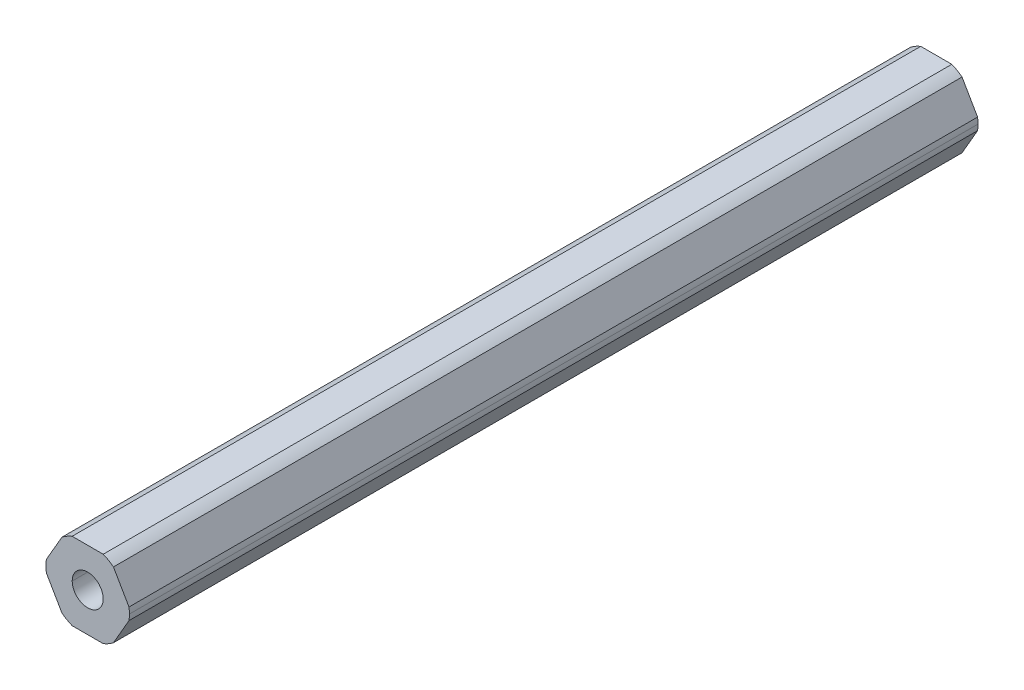
ISO-10303-21;
HEADER;
FILE_DESCRIPTION(('STEP AP214'),'2;1');
FILE_NAME('part.step','',(''),(''),'','','');
FILE_SCHEMA(('AUTOMOTIVE_DESIGN { 1 0 10303 214 1 1 1 1 }'));
ENDSEC;
DATA;
#1=APPLICATION_CONTEXT('core data for automotive mechanical design processes');
#2=APPLICATION_PROTOCOL_DEFINITION('international standard','automotive_design',2000,#1);
#3=PRODUCT_CONTEXT('',#1,'mechanical');
#4=PRODUCT('Part','Part','',(#3));
#5=PRODUCT_RELATED_PRODUCT_CATEGORY('part','',(#4));
#6=PRODUCT_DEFINITION_FORMATION('','',#4);
#7=PRODUCT_DEFINITION_CONTEXT('part definition',#1,'design');
#8=PRODUCT_DEFINITION('design','',#6,#7);
#9=PRODUCT_DEFINITION_SHAPE('','',#8);
#10=(LENGTH_UNIT() NAMED_UNIT(*) SI_UNIT(.MILLI.,.METRE.));
#11=(NAMED_UNIT(*) PLANE_ANGLE_UNIT() SI_UNIT($,.RADIAN.));
#12=(NAMED_UNIT(*) SI_UNIT($,.STERADIAN.) SOLID_ANGLE_UNIT());
#13=UNCERTAINTY_MEASURE_WITH_UNIT(LENGTH_MEASURE(1.E-05),#10,'distance_accuracy_value','');
#14=(GEOMETRIC_REPRESENTATION_CONTEXT(3) GLOBAL_UNCERTAINTY_ASSIGNED_CONTEXT((#13)) GLOBAL_UNIT_ASSIGNED_CONTEXT((#10,
#11,#12)) REPRESENTATION_CONTEXT('',''));
#15=CARTESIAN_POINT('',(0.,0.,0.));
#16=DIRECTION('',(0.,0.,1.));
#17=DIRECTION('',(1.,0.,0.));
#18=AXIS2_PLACEMENT_3D('',#15,#16,#17);
#19=CARTESIAN_POINT('',(0.,0.,-457.2));
#20=DIRECTION('',(0.,0.,1.));
#21=DIRECTION('',(1.,0.,0.));
#22=AXIS2_PLACEMENT_3D('',#19,#20,#21);
#23=CYLINDRICAL_SURFACE('',#22,2.55);
#24=DIRECTION('',(0.,0.,1.));
#25=VECTOR('',#24,1.);
#26=CARTESIAN_POINT('',(2.55,0.,-457.2));
#27=LINE('',#26,#25);
#28=CARTESIAN_POINT('',(2.55,0.,-457.2));
#29=VERTEX_POINT('',#28);
#30=CARTESIAN_POINT('',(2.55,0.,-317.5));
#31=VERTEX_POINT('',#30);
#32=EDGE_CURVE('E267',#29,#31,#27,.T.);
#33=ORIENTED_EDGE('',*,*,#32,.T.);
#34=CARTESIAN_POINT('',(0.,0.,-317.5));
#35=DIRECTION('',(0.,0.,-1.));
#36=DIRECTION('',(-1.,0.,0.));
#37=AXIS2_PLACEMENT_3D('',#34,#35,#36);
#38=CIRCLE('',#37,2.55);
#39=CARTESIAN_POINT('',(-2.55,0.,-317.5));
#40=VERTEX_POINT('',#39);
#41=EDGE_CURVE('E72',#31,#40,#38,.F.);
#42=ORIENTED_EDGE('',*,*,#41,.T.);
#43=DIRECTION('',(0.,0.,1.));
#44=VECTOR('',#43,1.);
#45=CARTESIAN_POINT('',(-2.55,0.,-457.2));
#46=LINE('',#45,#44);
#47=CARTESIAN_POINT('',(-2.55,0.,-457.2));
#48=VERTEX_POINT('',#47);
#49=EDGE_CURVE('E263',#48,#40,#46,.T.);
#50=ORIENTED_EDGE('',*,*,#49,.F.);
#51=CARTESIAN_POINT('',(0.,0.,-457.2));
#52=DIRECTION('',(0.,0.,1.));
#53=DIRECTION('',(1.,0.,0.));
#54=AXIS2_PLACEMENT_3D('',#51,#52,#53);
#55=CIRCLE('',#54,2.55);
#56=EDGE_CURVE('E58',#29,#48,#55,.T.);
#57=ORIENTED_EDGE('',*,*,#56,.F.);
#58=EDGE_LOOP('',(#33,#42,#50,#57));
#59=FACE_BOUND('',#58,.T.);
#60=ADVANCED_FACE('F49',(#59),#23,.F.);
#61=CARTESIAN_POINT('',(0.,0.,-457.2));
#62=DIRECTION('',(0.,0.,1.));
#63=DIRECTION('',(1.,0.,0.));
#64=AXIS2_PLACEMENT_3D('',#61,#62,#63);
#65=CYLINDRICAL_SURFACE('',#64,6.87);
#66=CARTESIAN_POINT('',(0.,0.,-317.5));
#67=DIRECTION('',(0.,0.,-1.));
#68=DIRECTION('',(-1.,0.,0.));
#69=AXIS2_PLACEMENT_3D('',#66,#67,#68);
#70=CIRCLE('',#69,6.87);
#71=CARTESIAN_POINT('',(4.24149521323254,5.40431479062105,-317.5));
#72=VERTEX_POINT('',#71);
#73=CARTESIAN_POINT('',(2.55952629210953,6.3754,-317.5));
#74=VERTEX_POINT('',#73);
#75=EDGE_CURVE('E169',#72,#74,#70,.F.);
#76=ORIENTED_EDGE('',*,*,#75,.F.);
#77=DIRECTION('',(0.,0.,-1.));
#78=VECTOR('',#77,1.);
#79=CARTESIAN_POINT('',(4.24149521323254,5.40431479062105,-457.2));
#80=LINE('',#79,#78);
#81=CARTESIAN_POINT('',(4.24149521323254,5.40431479062105,-457.2));
#82=VERTEX_POINT('',#81);
#83=EDGE_CURVE('E198',#72,#82,#80,.T.);
#84=ORIENTED_EDGE('',*,*,#83,.T.);
#85=CARTESIAN_POINT('',(0.,0.,-457.2));
#86=DIRECTION('',(0.,0.,1.));
#87=DIRECTION('',(1.,0.,0.));
#88=AXIS2_PLACEMENT_3D('',#85,#86,#87);
#89=CIRCLE('',#88,6.87);
#90=CARTESIAN_POINT('',(2.55952629210952,6.3754,-457.2));
#91=VERTEX_POINT('',#90);
#92=EDGE_CURVE('E194',#82,#91,#89,.T.);
#93=ORIENTED_EDGE('',*,*,#92,.T.);
#94=DIRECTION('',(0.,0.,1.));
#95=VECTOR('',#94,1.);
#96=CARTESIAN_POINT('',(2.55952629210952,6.3754,-457.2));
#97=LINE('',#96,#95);
#98=EDGE_CURVE('E187',#91,#74,#97,.T.);
#99=ORIENTED_EDGE('',*,*,#98,.T.);
#100=EDGE_LOOP('',(#76,#84,#93,#99));
#101=FACE_BOUND('',#100,.T.);
#102=ADVANCED_FACE('F192',(#101),#65,.T.);
#103=CARTESIAN_POINT('',(0.,0.,-457.2));
#104=DIRECTION('',(0.,0.,1.));
#105=DIRECTION('',(1.,0.,0.));
#106=AXIS2_PLACEMENT_3D('',#103,#104,#105);
#107=CYLINDRICAL_SURFACE('',#106,6.87);
#108=CARTESIAN_POINT('',(0.,0.,-317.5));
#109=DIRECTION('',(0.,0.,-1.));
#110=DIRECTION('',(-1.,0.,0.));
#111=AXIS2_PLACEMENT_3D('',#108,#109,#110);
#112=CIRCLE('',#111,6.87);
#113=CARTESIAN_POINT('',(-2.55952629210953,6.3754,-317.5));
#114=VERTEX_POINT('',#113);
#115=CARTESIAN_POINT('',(-4.24149521323254,5.40431479062105,-317.5));
#116=VERTEX_POINT('',#115);
#117=EDGE_CURVE('E328',#114,#116,#112,.F.);
#118=ORIENTED_EDGE('',*,*,#117,.F.);
#119=DIRECTION('',(0.,0.,-1.));
#120=VECTOR('',#119,1.);
#121=CARTESIAN_POINT('',(-2.55952629210953,6.3754,-457.2));
#122=LINE('',#121,#120);
#123=CARTESIAN_POINT('',(-2.55952629210953,6.3754,-457.2));
#124=VERTEX_POINT('',#123);
#125=EDGE_CURVE('E188',#114,#124,#122,.T.);
#126=ORIENTED_EDGE('',*,*,#125,.T.);
#127=CARTESIAN_POINT('',(0.,0.,-457.2));
#128=DIRECTION('',(0.,0.,1.));
#129=DIRECTION('',(1.,0.,0.));
#130=AXIS2_PLACEMENT_3D('',#127,#128,#129);
#131=CIRCLE('',#130,6.87);
#132=CARTESIAN_POINT('',(-4.24149521323255,5.40431479062105,-457.2));
#133=VERTEX_POINT('',#132);
#134=EDGE_CURVE('E302',#124,#133,#131,.T.);
#135=ORIENTED_EDGE('',*,*,#134,.T.);
#136=DIRECTION('',(0.,0.,1.));
#137=VECTOR('',#136,1.);
#138=CARTESIAN_POINT('',(-4.24149521323255,5.40431479062105,-457.2));
#139=LINE('',#138,#137);
#140=EDGE_CURVE('E211',#133,#116,#139,.T.);
#141=ORIENTED_EDGE('',*,*,#140,.T.);
#142=EDGE_LOOP('',(#118,#126,#135,#141));
#143=FACE_BOUND('',#142,.T.);
#144=ADVANCED_FACE('F526',(#143),#107,.T.);
#145=CARTESIAN_POINT('',(0.,0.,-457.2));
#146=DIRECTION('',(0.,0.,1.));
#147=DIRECTION('',(1.,0.,0.));
#148=AXIS2_PLACEMENT_3D('',#145,#146,#147);
#149=CYLINDRICAL_SURFACE('',#148,6.87);
#150=CARTESIAN_POINT('',(0.,0.,-317.5));
#151=DIRECTION('',(0.,0.,-1.));
#152=DIRECTION('',(-1.,0.,0.));
#153=AXIS2_PLACEMENT_3D('',#150,#151,#152);
#154=CIRCLE('',#153,6.87);
#155=CARTESIAN_POINT('',(-6.80102150534207,0.97108520937896,-317.5));
#156=VERTEX_POINT('',#155);
#157=CARTESIAN_POINT('',(-6.80102150534208,-0.971085209378956,-317.5));
#158=VERTEX_POINT('',#157);
#159=EDGE_CURVE('E332',#156,#158,#154,.F.);
#160=ORIENTED_EDGE('',*,*,#159,.F.);
#161=DIRECTION('',(0.,0.,-1.));
#162=VECTOR('',#161,1.);
#163=CARTESIAN_POINT('',(-6.80102150534208,0.97108520937896,-457.2));
#164=LINE('',#163,#162);
#165=CARTESIAN_POINT('',(-6.80102150534208,0.97108520937896,-457.2));
#166=VERTEX_POINT('',#165);
#167=EDGE_CURVE('E217',#156,#166,#164,.T.);
#168=ORIENTED_EDGE('',*,*,#167,.T.);
#169=CARTESIAN_POINT('',(0.,0.,-457.2));
#170=DIRECTION('',(0.,0.,1.));
#171=DIRECTION('',(1.,0.,0.));
#172=AXIS2_PLACEMENT_3D('',#169,#170,#171);
#173=CIRCLE('',#172,6.87);
#174=CARTESIAN_POINT('',(-6.80102150534208,-0.971085209378956,-457.2));
#175=VERTEX_POINT('',#174);
#176=EDGE_CURVE('E259',#166,#175,#173,.T.);
#177=ORIENTED_EDGE('',*,*,#176,.T.);
#178=DIRECTION('',(0.,0.,1.));
#179=VECTOR('',#178,1.);
#180=CARTESIAN_POINT('',(-6.80102150534208,-0.971085209378962,-457.2));
#181=LINE('',#180,#179);
#182=EDGE_CURVE('E212',#175,#158,#181,.T.);
#183=ORIENTED_EDGE('',*,*,#182,.T.);
#184=EDGE_LOOP('',(#160,#168,#177,#183));
#185=FACE_BOUND('',#184,.T.);
#186=ADVANCED_FACE('F316',(#185),#149,.T.);
#187=CARTESIAN_POINT('',(0.,0.,-457.2));
#188=DIRECTION('',(0.,0.,1.));
#189=DIRECTION('',(1.,0.,0.));
#190=AXIS2_PLACEMENT_3D('',#187,#188,#189);
#191=CYLINDRICAL_SURFACE('',#190,6.87);
#192=CARTESIAN_POINT('',(0.,0.,-317.5));
#193=DIRECTION('',(0.,0.,-1.));
#194=DIRECTION('',(-1.,0.,0.));
#195=AXIS2_PLACEMENT_3D('',#192,#193,#194);
#196=CIRCLE('',#195,6.87);
#197=CARTESIAN_POINT('',(-4.24149521323254,-5.40431479062105,-317.5));
#198=VERTEX_POINT('',#197);
#199=CARTESIAN_POINT('',(-2.55952629210953,-6.3754,-317.5));
#200=VERTEX_POINT('',#199);
#201=EDGE_CURVE('E264',#198,#200,#196,.F.);
#202=ORIENTED_EDGE('',*,*,#201,.F.);
#203=DIRECTION('',(0.,0.,-1.));
#204=VECTOR('',#203,1.);
#205=CARTESIAN_POINT('',(-4.24149521323255,-5.40431479062104,-457.2));
#206=LINE('',#205,#204);
#207=CARTESIAN_POINT('',(-4.24149521323254,-5.40431479062105,-457.2));
#208=VERTEX_POINT('',#207);
#209=EDGE_CURVE('E255',#198,#208,#206,.T.);
#210=ORIENTED_EDGE('',*,*,#209,.T.);
#211=CARTESIAN_POINT('',(0.,0.,-457.2));
#212=DIRECTION('',(0.,0.,1.));
#213=DIRECTION('',(1.,0.,0.));
#214=AXIS2_PLACEMENT_3D('',#211,#212,#213);
#215=CIRCLE('',#214,6.87);
#216=CARTESIAN_POINT('',(-2.55952629210953,-6.3754,-457.2));
#217=VERTEX_POINT('',#216);
#218=EDGE_CURVE('E256',#208,#217,#215,.T.);
#219=ORIENTED_EDGE('',*,*,#218,.T.);
#220=DIRECTION('',(0.,0.,1.));
#221=VECTOR('',#220,1.);
#222=CARTESIAN_POINT('',(-2.55952629210953,-6.3754,-457.2));
#223=LINE('',#222,#221);
#224=EDGE_CURVE('E245',#217,#200,#223,.T.);
#225=ORIENTED_EDGE('',*,*,#224,.T.);
#226=EDGE_LOOP('',(#202,#210,#219,#225));
#227=FACE_BOUND('',#226,.T.);
#228=ADVANCED_FACE('F363',(#227),#191,.T.);
#229=CARTESIAN_POINT('',(0.,0.,-457.2));
#230=DIRECTION('',(0.,0.,1.));
#231=DIRECTION('',(1.,0.,0.));
#232=AXIS2_PLACEMENT_3D('',#229,#230,#231);
#233=CYLINDRICAL_SURFACE('',#232,6.87);
#234=CARTESIAN_POINT('',(0.,0.,-317.5));
#235=DIRECTION('',(0.,0.,-1.));
#236=DIRECTION('',(-1.,0.,0.));
#237=AXIS2_PLACEMENT_3D('',#234,#235,#236);
#238=CIRCLE('',#237,6.87);
#239=CARTESIAN_POINT('',(2.55952629210953,-6.3754,-317.5));
#240=VERTEX_POINT('',#239);
#241=CARTESIAN_POINT('',(4.24149521323254,-5.40431479062105,-317.5));
#242=VERTEX_POINT('',#241);
#243=EDGE_CURVE('E342',#240,#242,#238,.F.);
#244=ORIENTED_EDGE('',*,*,#243,.F.);
#245=DIRECTION('',(0.,0.,-1.));
#246=VECTOR('',#245,1.);
#247=CARTESIAN_POINT('',(2.55952629210953,-6.3754,-457.2));
#248=LINE('',#247,#246);
#249=CARTESIAN_POINT('',(2.55952629210953,-6.3754,-457.2));
#250=VERTEX_POINT('',#249);
#251=EDGE_CURVE('E244',#240,#250,#248,.T.);
#252=ORIENTED_EDGE('',*,*,#251,.T.);
#253=CARTESIAN_POINT('',(0.,0.,-457.2));
#254=DIRECTION('',(0.,0.,1.));
#255=DIRECTION('',(1.,0.,0.));
#256=AXIS2_PLACEMENT_3D('',#253,#254,#255);
#257=CIRCLE('',#256,6.87);
#258=CARTESIAN_POINT('',(4.24149521323254,-5.40431479062105,-457.2));
#259=VERTEX_POINT('',#258);
#260=EDGE_CURVE('E220',#250,#259,#257,.T.);
#261=ORIENTED_EDGE('',*,*,#260,.T.);
#262=DIRECTION('',(0.,0.,1.));
#263=VECTOR('',#262,1.);
#264=CARTESIAN_POINT('',(4.24149521323255,-5.40431479062104,-457.2));
#265=LINE('',#264,#263);
#266=EDGE_CURVE('E296',#259,#242,#265,.T.);
#267=ORIENTED_EDGE('',*,*,#266,.T.);
#268=EDGE_LOOP('',(#244,#252,#261,#267));
#269=FACE_BOUND('',#268,.T.);
#270=ADVANCED_FACE('F369',(#269),#233,.T.);
#271=CARTESIAN_POINT('',(0.,0.,-457.2));
#272=DIRECTION('',(0.,0.,1.));
#273=DIRECTION('',(1.,0.,0.));
#274=AXIS2_PLACEMENT_3D('',#271,#272,#273);
#275=CYLINDRICAL_SURFACE('',#274,6.87);
#276=CARTESIAN_POINT('',(0.,0.,-317.5));
#277=DIRECTION('',(0.,0.,-1.));
#278=DIRECTION('',(-1.,0.,0.));
#279=AXIS2_PLACEMENT_3D('',#276,#277,#278);
#280=CIRCLE('',#279,6.87);
#281=CARTESIAN_POINT('',(6.87,0.,-317.5));
#282=VERTEX_POINT('',#281);
#283=CARTESIAN_POINT('',(6.80102150534208,0.97108520937895,-317.5));
#284=VERTEX_POINT('',#283);
#285=EDGE_CURVE('E345',#282,#284,#280,.F.);
#286=ORIENTED_EDGE('',*,*,#285,.F.);
#287=DIRECTION('',(0.,0.,1.));
#288=VECTOR('',#287,1.);
#289=CARTESIAN_POINT('',(6.87,0.,-457.2));
#290=LINE('',#289,#288);
#291=CARTESIAN_POINT('',(6.87,0.,-457.2));
#292=VERTEX_POINT('',#291);
#293=EDGE_CURVE('E277',#292,#282,#290,.T.);
#294=ORIENTED_EDGE('',*,*,#293,.F.);
#295=CARTESIAN_POINT('',(0.,0.,-457.2));
#296=DIRECTION('',(0.,0.,1.));
#297=DIRECTION('',(1.,0.,0.));
#298=AXIS2_PLACEMENT_3D('',#295,#296,#297);
#299=CIRCLE('',#298,6.87);
#300=CARTESIAN_POINT('',(6.80102150534208,0.97108520937895,-457.2));
#301=VERTEX_POINT('',#300);
#302=EDGE_CURVE('E218',#292,#301,#299,.T.);
#303=ORIENTED_EDGE('',*,*,#302,.T.);
#304=DIRECTION('',(0.,0.,1.));
#305=VECTOR('',#304,1.);
#306=CARTESIAN_POINT('',(6.80102150534208,0.971085209378949,-457.2));
#307=LINE('',#306,#305);
#308=EDGE_CURVE('E251',#301,#284,#307,.T.);
#309=ORIENTED_EDGE('',*,*,#308,.T.);
#310=EDGE_LOOP('',(#286,#294,#303,#309));
#311=FACE_BOUND('',#310,.T.);
#312=ADVANCED_FACE('F502',(#311),#275,.T.);
#313=CARTESIAN_POINT('',(0.,0.,-457.2));
#314=DIRECTION('',(0.,0.,1.));
#315=DIRECTION('',(1.,0.,0.));
#316=AXIS2_PLACEMENT_3D('',#313,#314,#315);
#317=PLANE('',#316);
#318=ORIENTED_EDGE('',*,*,#56,.T.);
#319=CARTESIAN_POINT('',(0.,0.,-457.2));
#320=DIRECTION('',(0.,0.,1.));
#321=DIRECTION('',(1.,0.,0.));
#322=AXIS2_PLACEMENT_3D('',#319,#320,#321);
#323=CIRCLE('',#322,2.55);
#324=EDGE_CURVE('E260',#48,#29,#323,.T.);
#325=ORIENTED_EDGE('',*,*,#324,.T.);
#326=EDGE_LOOP('',(#318,#325));
#327=FACE_BOUND('',#326,.T.);
#328=ORIENTED_EDGE('',*,*,#92,.F.);
#329=DIRECTION('',(-0.5,0.866025403784439,0.));
#330=VECTOR('',#329,1.);
#331=CARTESIAN_POINT('',(7.36167781238308,0.,-457.2));
#332=LINE('',#331,#330);
#333=EDGE_CURVE('E204',#301,#82,#332,.T.);
#334=ORIENTED_EDGE('',*,*,#333,.F.);
#335=ORIENTED_EDGE('',*,*,#302,.F.);
#336=CARTESIAN_POINT('',(0.,0.,-457.2));
#337=DIRECTION('',(0.,0.,1.));
#338=DIRECTION('',(1.,0.,0.));
#339=AXIS2_PLACEMENT_3D('',#336,#337,#338);
#340=CIRCLE('',#339,6.87);
#341=CARTESIAN_POINT('',(6.80102150534208,-0.971085209378955,-457.2));
#342=VERTEX_POINT('',#341);
#343=EDGE_CURVE('E270',#342,#292,#340,.T.);
#344=ORIENTED_EDGE('',*,*,#343,.F.);
#345=DIRECTION('',(0.5,0.866025403784439,0.));
#346=VECTOR('',#345,1.);
#347=CARTESIAN_POINT('',(3.68083890619154,-6.3754,-457.2));
#348=LINE('',#347,#346);
#349=EDGE_CURVE('E290',#259,#342,#348,.T.);
#350=ORIENTED_EDGE('',*,*,#349,.F.);
#351=ORIENTED_EDGE('',*,*,#260,.F.);
#352=DIRECTION('',(1.,0.,0.));
#353=VECTOR('',#352,1.);
#354=CARTESIAN_POINT('',(-3.68083890619154,-6.3754,-457.2));
#355=LINE('',#354,#353);
#356=EDGE_CURVE('E240',#217,#250,#355,.T.);
#357=ORIENTED_EDGE('',*,*,#356,.F.);
#358=ORIENTED_EDGE('',*,*,#218,.F.);
#359=DIRECTION('',(0.5,-0.866025403784439,0.));
#360=VECTOR('',#359,1.);
#361=CARTESIAN_POINT('',(-7.36167781238308,0.,-457.2));
#362=LINE('',#361,#360);
#363=EDGE_CURVE('E216',#175,#208,#362,.T.);
#364=ORIENTED_EDGE('',*,*,#363,.F.);
#365=ORIENTED_EDGE('',*,*,#176,.F.);
#366=DIRECTION('',(-0.5,-0.866025403784439,0.));
#367=VECTOR('',#366,1.);
#368=CARTESIAN_POINT('',(-3.68083890619154,6.3754,-457.2));
#369=LINE('',#368,#367);
#370=EDGE_CURVE('E223',#133,#166,#369,.T.);
#371=ORIENTED_EDGE('',*,*,#370,.F.);
#372=ORIENTED_EDGE('',*,*,#134,.F.);
#373=DIRECTION('',(-1.,0.,0.));
#374=VECTOR('',#373,1.);
#375=CARTESIAN_POINT('',(3.68083890619154,6.3754,-457.2));
#376=LINE('',#375,#374);
#377=EDGE_CURVE('E197',#91,#124,#376,.T.);
#378=ORIENTED_EDGE('',*,*,#377,.F.);
#379=EDGE_LOOP('',(#328,#334,#335,#344,#350,#351,#357,#358,#364,#365,#371,#372,#378));
#380=FACE_BOUND('',#379,.T.);
#381=ADVANCED_FACE('F320',(#327,#380),#317,.F.);
#382=CARTESIAN_POINT('',(-3.68083890619154,-6.3754,457.2));
#383=DIRECTION('',(0.,1.,0.));
#384=DIRECTION('',(1.,0.,0.));
#385=AXIS2_PLACEMENT_3D('',#382,#383,#384);
#386=PLANE('',#385);
#387=ORIENTED_EDGE('',*,*,#251,.F.);
#388=DIRECTION('',(-1.,0.,0.));
#389=VECTOR('',#388,1.);
#390=CARTESIAN_POINT('',(-23.065396683762,-6.3754,-317.5));
#391=LINE('',#390,#389);
#392=EDGE_CURVE('E190',#240,#200,#391,.T.);
#393=ORIENTED_EDGE('',*,*,#392,.T.);
#394=ORIENTED_EDGE('',*,*,#224,.F.);
#395=ORIENTED_EDGE('',*,*,#356,.T.);
#396=EDGE_LOOP('',(#387,#393,#394,#395));
#397=FACE_BOUND('',#396,.T.);
#398=ADVANCED_FACE('F360',(#397),#386,.F.);
#399=CARTESIAN_POINT('',(-7.36167781238308,0.,457.2));
#400=DIRECTION('',(0.866025403784439,0.5,0.));
#401=DIRECTION('',(0.,0.,-1.));
#402=AXIS2_PLACEMENT_3D('',#399,#400,#401);
#403=PLANE('',#402);
#404=ORIENTED_EDGE('',*,*,#209,.F.);
#405=DIRECTION('',(-0.5,0.866025403784439,0.));
#406=VECTOR('',#405,1.);
#407=CARTESIAN_POINT('',(-7.36167781238308,0.,-317.5));
#408=LINE('',#407,#406);
#409=EDGE_CURVE('E325',#198,#158,#408,.T.);
#410=ORIENTED_EDGE('',*,*,#409,.T.);
#411=ORIENTED_EDGE('',*,*,#182,.F.);
#412=ORIENTED_EDGE('',*,*,#363,.T.);
#413=EDGE_LOOP('',(#404,#410,#411,#412));
#414=FACE_BOUND('',#413,.T.);
#415=ADVANCED_FACE('F51',(#414),#403,.F.);
#416=CARTESIAN_POINT('',(-3.68083890619154,6.3754,457.2));
#417=DIRECTION('',(0.866025403784439,-0.5,0.));
#418=DIRECTION('',(0.,0.,-1.));
#419=AXIS2_PLACEMENT_3D('',#416,#417,#418);
#420=PLANE('',#419);
#421=ORIENTED_EDGE('',*,*,#167,.F.);
#422=DIRECTION('',(0.5,0.866025403784439,0.));
#423=VECTOR('',#422,1.);
#424=CARTESIAN_POINT('',(-3.68083890619154,6.3754,-317.5));
#425=LINE('',#424,#423);
#426=EDGE_CURVE('E180',#156,#116,#425,.T.);
#427=ORIENTED_EDGE('',*,*,#426,.T.);
#428=ORIENTED_EDGE('',*,*,#140,.F.);
#429=ORIENTED_EDGE('',*,*,#370,.T.);
#430=EDGE_LOOP('',(#421,#427,#428,#429));
#431=FACE_BOUND('',#430,.T.);
#432=ADVANCED_FACE('F476',(#431),#420,.F.);
#433=CARTESIAN_POINT('',(3.68083890619154,6.3754,457.2));
#434=DIRECTION('',(0.,-1.,0.));
#435=DIRECTION('',(0.,0.,-1.));
#436=AXIS2_PLACEMENT_3D('',#433,#434,#435);
#437=PLANE('',#436);
#438=ORIENTED_EDGE('',*,*,#125,.F.);
#439=DIRECTION('',(-1.,0.,0.));
#440=VECTOR('',#439,1.);
#441=CARTESIAN_POINT('',(-23.065396683762,6.3754,-317.5));
#442=LINE('',#441,#440);
#443=EDGE_CURVE('E172',#74,#114,#442,.T.);
#444=ORIENTED_EDGE('',*,*,#443,.F.);
#445=ORIENTED_EDGE('',*,*,#98,.F.);
#446=ORIENTED_EDGE('',*,*,#377,.T.);
#447=EDGE_LOOP('',(#438,#444,#445,#446));
#448=FACE_BOUND('',#447,.T.);
#449=ADVANCED_FACE('F185',(#448),#437,.F.);
#450=CARTESIAN_POINT('',(7.36167781238308,0.,457.2));
#451=DIRECTION('',(-0.866025403784439,-0.5,0.));
#452=DIRECTION('',(-0.5,0.866025403784439,0.));
#453=AXIS2_PLACEMENT_3D('',#450,#451,#452);
#454=PLANE('',#453);
#455=ORIENTED_EDGE('',*,*,#83,.F.);
#456=DIRECTION('',(0.5,-0.866025403784439,0.));
#457=VECTOR('',#456,1.);
#458=CARTESIAN_POINT('',(7.36167781238308,0.,-317.5));
#459=LINE('',#458,#457);
#460=EDGE_CURVE('E175',#72,#284,#459,.T.);
#461=ORIENTED_EDGE('',*,*,#460,.T.);
#462=ORIENTED_EDGE('',*,*,#308,.F.);
#463=ORIENTED_EDGE('',*,*,#333,.T.);
#464=EDGE_LOOP('',(#455,#461,#462,#463));
#465=FACE_BOUND('',#464,.T.);
#466=ADVANCED_FACE('F458',(#465),#454,.F.);
#467=CARTESIAN_POINT('',(3.68083890619154,-6.3754,457.2));
#468=DIRECTION('',(-0.866025403784439,0.5,0.));
#469=DIRECTION('',(0.,0.,1.));
#470=AXIS2_PLACEMENT_3D('',#467,#468,#469);
#471=PLANE('',#470);
#472=DIRECTION('',(0.,0.,-1.));
#473=VECTOR('',#472,1.);
#474=CARTESIAN_POINT('',(6.80102150534208,-0.971085209378962,-457.2));
#475=LINE('',#474,#473);
#476=CARTESIAN_POINT('',(6.80102150534208,-0.971085209378962,-317.5));
#477=VERTEX_POINT('',#476);
#478=EDGE_CURVE('E238',#477,#342,#475,.T.);
#479=ORIENTED_EDGE('',*,*,#478,.F.);
#480=DIRECTION('',(-0.5,-0.866025403784439,0.));
#481=VECTOR('',#480,1.);
#482=CARTESIAN_POINT('',(3.68083890619154,-6.3754,-317.5));
#483=LINE('',#482,#481);
#484=EDGE_CURVE('E65',#477,#242,#483,.T.);
#485=ORIENTED_EDGE('',*,*,#484,.T.);
#486=ORIENTED_EDGE('',*,*,#266,.F.);
#487=ORIENTED_EDGE('',*,*,#349,.T.);
#488=EDGE_LOOP('',(#479,#485,#486,#487));
#489=FACE_BOUND('',#488,.T.);
#490=ADVANCED_FACE('F372',(#489),#471,.F.);
#491=CARTESIAN_POINT('',(0.,0.,-457.2));
#492=DIRECTION('',(0.,0.,1.));
#493=DIRECTION('',(1.,0.,0.));
#494=AXIS2_PLACEMENT_3D('',#491,#492,#493);
#495=CYLINDRICAL_SURFACE('',#494,6.87);
#496=CARTESIAN_POINT('',(0.,0.,-317.5));
#497=DIRECTION('',(0.,0.,-1.));
#498=DIRECTION('',(-1.,0.,0.));
#499=AXIS2_PLACEMENT_3D('',#496,#497,#498);
#500=CIRCLE('',#499,6.87);
#501=EDGE_CURVE('E350',#477,#282,#500,.F.);
#502=ORIENTED_EDGE('',*,*,#501,.F.);
#503=ORIENTED_EDGE('',*,*,#478,.T.);
#504=ORIENTED_EDGE('',*,*,#343,.T.);
#505=ORIENTED_EDGE('',*,*,#293,.T.);
#506=EDGE_LOOP('',(#502,#503,#504,#505));
#507=FACE_BOUND('',#506,.T.);
#508=ADVANCED_FACE('F441',(#507),#495,.T.);
#509=CARTESIAN_POINT('',(0.,0.,-457.2));
#510=DIRECTION('',(0.,0.,1.));
#511=DIRECTION('',(1.,0.,0.));
#512=AXIS2_PLACEMENT_3D('',#509,#510,#511);
#513=CYLINDRICAL_SURFACE('',#512,2.55);
#514=ORIENTED_EDGE('',*,*,#49,.T.);
#515=CARTESIAN_POINT('',(0.,0.,-317.5));
#516=DIRECTION('',(0.,0.,-1.));
#517=DIRECTION('',(-1.,0.,0.));
#518=AXIS2_PLACEMENT_3D('',#515,#516,#517);
#519=CIRCLE('',#518,2.55);
#520=EDGE_CURVE('E11',#40,#31,#519,.F.);
#521=ORIENTED_EDGE('',*,*,#520,.T.);
#522=ORIENTED_EDGE('',*,*,#32,.F.);
#523=ORIENTED_EDGE('',*,*,#324,.F.);
#524=EDGE_LOOP('',(#514,#521,#522,#523));
#525=FACE_BOUND('',#524,.T.);
#526=ADVANCED_FACE('F430',(#525),#513,.F.);
#527=CARTESIAN_POINT('',(-23.065396683762,-6.3754,-317.5));
#528=DIRECTION('',(0.,0.,-1.));
#529=DIRECTION('',(-1.,0.,0.));
#530=AXIS2_PLACEMENT_3D('',#527,#528,#529);
#531=PLANE('',#530);
#532=ORIENTED_EDGE('',*,*,#201,.T.);
#533=ORIENTED_EDGE('',*,*,#392,.F.);
#534=ORIENTED_EDGE('',*,*,#243,.T.);
#535=ORIENTED_EDGE('',*,*,#484,.F.);
#536=ORIENTED_EDGE('',*,*,#501,.T.);
#537=ORIENTED_EDGE('',*,*,#285,.T.);
#538=ORIENTED_EDGE('',*,*,#460,.F.);
#539=ORIENTED_EDGE('',*,*,#75,.T.);
#540=ORIENTED_EDGE('',*,*,#443,.T.);
#541=ORIENTED_EDGE('',*,*,#117,.T.);
#542=ORIENTED_EDGE('',*,*,#426,.F.);
#543=ORIENTED_EDGE('',*,*,#159,.T.);
#544=ORIENTED_EDGE('',*,*,#409,.F.);
#545=EDGE_LOOP('',(#532,#533,#534,#535,#536,#537,#538,#539,#540,#541,#542,#543,#544));
#546=FACE_BOUND('',#545,.T.);
#547=ORIENTED_EDGE('',*,*,#520,.F.);
#548=ORIENTED_EDGE('',*,*,#41,.F.);
#549=EDGE_LOOP('',(#547,#548));
#550=FACE_BOUND('',#549,.T.);
#551=ADVANCED_FACE('F171',(#546,#550),#531,.F.);
#552=CLOSED_SHELL('',(#60,#102,#144,#186,#228,#270,#312,#381,#398,#415,#432,#449,#466,#490,#508,
#526,#551));
#553=MANIFOLD_SOLID_BREP('B2',#552);
#554=ADVANCED_BREP_SHAPE_REPRESENTATION('',(#18,#553),#14);
#555=SHAPE_DEFINITION_REPRESENTATION(#9,#554);
ENDSEC;
END-ISO-10303-21;
